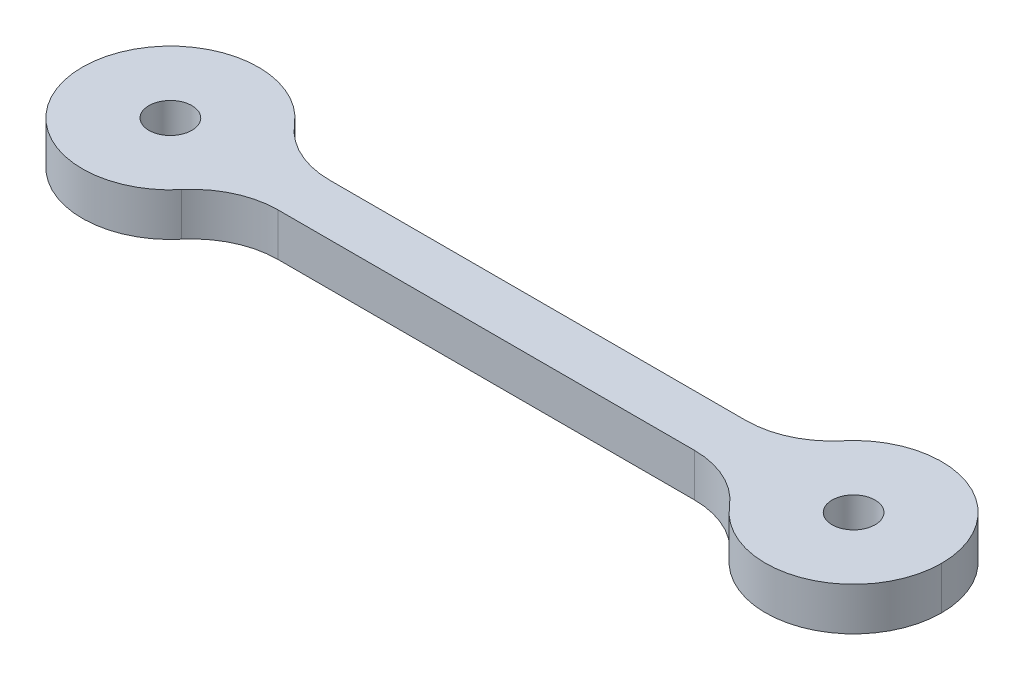
ISO-10303-21;
HEADER;
FILE_DESCRIPTION(('STEP AP214'),'2;1');
FILE_NAME('part.step','',(''),(''),'','','');
FILE_SCHEMA(('AUTOMOTIVE_DESIGN { 1 0 10303 214 1 1 1 1 }'));
ENDSEC;
DATA;
#1=APPLICATION_CONTEXT('core data for automotive mechanical design processes');
#2=APPLICATION_PROTOCOL_DEFINITION('international standard','automotive_design',2000,#1);
#3=PRODUCT_CONTEXT('',#1,'mechanical');
#4=PRODUCT('Part','Part','',(#3));
#5=PRODUCT_RELATED_PRODUCT_CATEGORY('part','',(#4));
#6=PRODUCT_DEFINITION_FORMATION('','',#4);
#7=PRODUCT_DEFINITION_CONTEXT('part definition',#1,'design');
#8=PRODUCT_DEFINITION('design','',#6,#7);
#9=PRODUCT_DEFINITION_SHAPE('','',#8);
#10=(LENGTH_UNIT() NAMED_UNIT(*) SI_UNIT(.MILLI.,.METRE.));
#11=(NAMED_UNIT(*) PLANE_ANGLE_UNIT() SI_UNIT($,.RADIAN.));
#12=(NAMED_UNIT(*) SI_UNIT($,.STERADIAN.) SOLID_ANGLE_UNIT());
#13=UNCERTAINTY_MEASURE_WITH_UNIT(LENGTH_MEASURE(1.E-05),#10,'distance_accuracy_value','');
#14=(GEOMETRIC_REPRESENTATION_CONTEXT(3) GLOBAL_UNCERTAINTY_ASSIGNED_CONTEXT((#13)) GLOBAL_UNIT_ASSIGNED_CONTEXT((#10,
#11,#12)) REPRESENTATION_CONTEXT('',''));
#15=CARTESIAN_POINT('',(0.,0.,0.));
#16=DIRECTION('',(0.,0.,1.));
#17=DIRECTION('',(1.,0.,0.));
#18=AXIS2_PLACEMENT_3D('',#15,#16,#17);
#19=CARTESIAN_POINT('',(0.,5.,0.));
#20=DIRECTION('',(0.,-1.,0.));
#21=DIRECTION('',(0.,0.,-1.));
#22=AXIS2_PLACEMENT_3D('',#19,#20,#21);
#23=PLANE('',#22);
#24=DIRECTION('',(1.,0.,0.));
#25=VECTOR('',#24,1.);
#26=CARTESIAN_POINT('',(20.0511478919563,5.,-13.25));
#27=LINE('',#26,#25);
#28=CARTESIAN_POINT('',(25.7761875552242,5.,-13.25));
#29=VERTEX_POINT('',#28);
#30=CARTESIAN_POINT('',(74.2238124447758,5.,-13.25));
#31=VERTEX_POINT('',#30);
#32=EDGE_CURVE('E137',#29,#31,#27,.T.);
#33=ORIENTED_EDGE('',*,*,#32,.F.);
#34=CARTESIAN_POINT('',(25.7761875552242,5.,-23.25));
#35=DIRECTION('',(0.,-1.,0.));
#36=DIRECTION('',(0.,0.,-1.));
#37=AXIS2_PLACEMENT_3D('',#34,#35,#36);
#38=CIRCLE('',#37,10.);
#39=CARTESIAN_POINT('',(18.1089344415333,5.,-16.8302469135803));
#40=VERTEX_POINT('',#39);
#41=EDGE_CURVE('E170',#29,#40,#38,.T.);
#42=ORIENTED_EDGE('',*,*,#41,.T.);
#43=CARTESIAN_POINT('',(10.25,5.,-10.25));
#44=DIRECTION('',(0.,-1.,0.));
#45=DIRECTION('',(0.,0.,-1.));
#46=AXIS2_PLACEMENT_3D('',#43,#44,#45);
#47=CIRCLE('',#46,10.25);
#48=CARTESIAN_POINT('',(0.,5.,-10.25));
#49=VERTEX_POINT('',#48);
#50=EDGE_CURVE('E247',#40,#49,#47,.F.);
#51=ORIENTED_EDGE('',*,*,#50,.T.);
#52=CARTESIAN_POINT('',(10.25,5.,-10.25));
#53=DIRECTION('',(0.,-1.,0.));
#54=DIRECTION('',(0.,0.,-1.));
#55=AXIS2_PLACEMENT_3D('',#52,#53,#54);
#56=CIRCLE('',#55,10.25);
#57=CARTESIAN_POINT('',(18.1089344415333,5.,-3.66975308641975));
#58=VERTEX_POINT('',#57);
#59=EDGE_CURVE('E129',#49,#58,#56,.F.);
#60=ORIENTED_EDGE('',*,*,#59,.T.);
#61=CARTESIAN_POINT('',(25.7761875552242,5.,2.75));
#62=DIRECTION('',(0.,-1.,0.));
#63=DIRECTION('',(0.,0.,-1.));
#64=AXIS2_PLACEMENT_3D('',#61,#62,#63);
#65=CIRCLE('',#64,10.);
#66=CARTESIAN_POINT('',(25.7761875552242,5.,-7.25));
#67=VERTEX_POINT('',#66);
#68=EDGE_CURVE('E41',#58,#67,#65,.T.);
#69=ORIENTED_EDGE('',*,*,#68,.T.);
#70=DIRECTION('',(-1.,0.,0.));
#71=VECTOR('',#70,1.);
#72=CARTESIAN_POINT('',(20.0511478919563,5.,-7.25));
#73=LINE('',#72,#71);
#74=CARTESIAN_POINT('',(74.2238124447758,5.,-7.25000000000002));
#75=VERTEX_POINT('',#74);
#76=EDGE_CURVE('E182',#75,#67,#73,.T.);
#77=ORIENTED_EDGE('',*,*,#76,.F.);
#78=CARTESIAN_POINT('',(74.2238124447758,5.,2.74999999999998));
#79=DIRECTION('',(0.,-1.,0.));
#80=DIRECTION('',(0.,0.,-1.));
#81=AXIS2_PLACEMENT_3D('',#78,#79,#80);
#82=CIRCLE('',#81,10.);
#83=CARTESIAN_POINT('',(81.8910655584668,5.,-3.66975308641976));
#84=VERTEX_POINT('',#83);
#85=EDGE_CURVE('E174',#75,#84,#82,.T.);
#86=ORIENTED_EDGE('',*,*,#85,.T.);
#87=CARTESIAN_POINT('',(89.75,5.,-10.25));
#88=DIRECTION('',(0.,-1.,0.));
#89=DIRECTION('',(0.,0.,-1.));
#90=AXIS2_PLACEMENT_3D('',#87,#88,#89);
#91=CIRCLE('',#90,10.25);
#92=CARTESIAN_POINT('',(100.,5.,-10.25));
#93=VERTEX_POINT('',#92);
#94=EDGE_CURVE('E115',#84,#93,#91,.F.);
#95=ORIENTED_EDGE('',*,*,#94,.T.);
#96=CARTESIAN_POINT('',(89.75,5.,-10.25));
#97=DIRECTION('',(0.,-1.,0.));
#98=DIRECTION('',(0.,0.,-1.));
#99=AXIS2_PLACEMENT_3D('',#96,#97,#98);
#100=CIRCLE('',#99,10.25);
#101=CARTESIAN_POINT('',(81.8910655584668,5.,-16.8302469135803));
#102=VERTEX_POINT('',#101);
#103=EDGE_CURVE('E246',#93,#102,#100,.F.);
#104=ORIENTED_EDGE('',*,*,#103,.T.);
#105=CARTESIAN_POINT('',(74.2238124447758,5.,-23.25));
#106=DIRECTION('',(0.,-1.,0.));
#107=DIRECTION('',(0.,0.,-1.));
#108=AXIS2_PLACEMENT_3D('',#105,#106,#107);
#109=CIRCLE('',#108,10.);
#110=EDGE_CURVE('E166',#102,#31,#109,.T.);
#111=ORIENTED_EDGE('',*,*,#110,.T.);
#112=EDGE_LOOP('',(#33,#42,#51,#60,#69,#77,#86,#95,#104,#111));
#113=FACE_BOUND('',#112,.T.);
#114=CARTESIAN_POINT('',(10.25,5.,-10.25));
#115=DIRECTION('',(0.,1.,0.));
#116=DIRECTION('',(0.,0.,1.));
#117=AXIS2_PLACEMENT_3D('',#114,#115,#116);
#118=CIRCLE('',#117,2.5);
#119=CARTESIAN_POINT('',(10.25,5.,-7.75));
#120=VERTEX_POINT('',#119);
#121=EDGE_CURVE('E241',#120,#120,#118,.T.);
#122=ORIENTED_EDGE('',*,*,#121,.F.);
#123=EDGE_LOOP('',(#122));
#124=FACE_BOUND('',#123,.T.);
#125=CARTESIAN_POINT('',(89.75,5.,-10.25));
#126=DIRECTION('',(0.,1.,0.));
#127=DIRECTION('',(0.,0.,-1.));
#128=AXIS2_PLACEMENT_3D('',#125,#126,#127);
#129=CIRCLE('',#128,2.50000000000001);
#130=CARTESIAN_POINT('',(89.75,5.,-12.75));
#131=VERTEX_POINT('',#130);
#132=EDGE_CURVE('E134',#131,#131,#129,.T.);
#133=ORIENTED_EDGE('',*,*,#132,.F.);
#134=EDGE_LOOP('',(#133));
#135=FACE_BOUND('',#134,.T.);
#136=ADVANCED_FACE('F33',(#113,#124,#135),#23,.F.);
#137=CARTESIAN_POINT('',(0.,0.,0.));
#138=DIRECTION('',(0.,-1.,0.));
#139=DIRECTION('',(0.,0.,-1.));
#140=AXIS2_PLACEMENT_3D('',#137,#138,#139);
#141=PLANE('',#140);
#142=CARTESIAN_POINT('',(10.25,0.,-10.25));
#143=DIRECTION('',(0.,-1.,0.));
#144=DIRECTION('',(0.,0.,-1.));
#145=AXIS2_PLACEMENT_3D('',#142,#143,#144);
#146=CIRCLE('',#145,10.25);
#147=CARTESIAN_POINT('',(0.,0.,-10.25));
#148=VERTEX_POINT('',#147);
#149=CARTESIAN_POINT('',(18.1089344415333,0.,-16.8302469135803));
#150=VERTEX_POINT('',#149);
#151=EDGE_CURVE('E111',#148,#150,#146,.T.);
#152=ORIENTED_EDGE('',*,*,#151,.T.);
#153=CARTESIAN_POINT('',(25.7761875552242,0.,-23.25));
#154=DIRECTION('',(0.,-1.,0.));
#155=DIRECTION('',(0.,0.,-1.));
#156=AXIS2_PLACEMENT_3D('',#153,#154,#155);
#157=CIRCLE('',#156,10.);
#158=CARTESIAN_POINT('',(25.7761875552242,0.,-13.25));
#159=VERTEX_POINT('',#158);
#160=EDGE_CURVE('E172',#150,#159,#157,.F.);
#161=ORIENTED_EDGE('',*,*,#160,.T.);
#162=DIRECTION('',(-1.,0.,0.));
#163=VECTOR('',#162,1.);
#164=CARTESIAN_POINT('',(0.,0.,-13.25));
#165=LINE('',#164,#163);
#166=CARTESIAN_POINT('',(74.2238124447758,0.,-13.25));
#167=VERTEX_POINT('',#166);
#168=EDGE_CURVE('E145',#167,#159,#165,.T.);
#169=ORIENTED_EDGE('',*,*,#168,.F.);
#170=CARTESIAN_POINT('',(74.2238124447758,0.,-23.25));
#171=DIRECTION('',(0.,-1.,0.));
#172=DIRECTION('',(0.,0.,-1.));
#173=AXIS2_PLACEMENT_3D('',#170,#171,#172);
#174=CIRCLE('',#173,10.);
#175=CARTESIAN_POINT('',(81.8910655584668,0.,-16.8302469135803));
#176=VERTEX_POINT('',#175);
#177=EDGE_CURVE('E168',#167,#176,#174,.F.);
#178=ORIENTED_EDGE('',*,*,#177,.T.);
#179=CARTESIAN_POINT('',(89.75,0.,-10.25));
#180=DIRECTION('',(0.,-1.,0.));
#181=DIRECTION('',(0.,0.,-1.));
#182=AXIS2_PLACEMENT_3D('',#179,#180,#181);
#183=CIRCLE('',#182,10.25);
#184=CARTESIAN_POINT('',(100.,0.,-10.25));
#185=VERTEX_POINT('',#184);
#186=EDGE_CURVE('E125',#176,#185,#183,.T.);
#187=ORIENTED_EDGE('',*,*,#186,.T.);
#188=CARTESIAN_POINT('',(89.75,0.,-10.25));
#189=DIRECTION('',(0.,-1.,0.));
#190=DIRECTION('',(0.,0.,-1.));
#191=AXIS2_PLACEMENT_3D('',#188,#189,#190);
#192=CIRCLE('',#191,10.25);
#193=CARTESIAN_POINT('',(81.8910655584668,0.,-3.66975308641976));
#194=VERTEX_POINT('',#193);
#195=EDGE_CURVE('E239',#185,#194,#192,.T.);
#196=ORIENTED_EDGE('',*,*,#195,.T.);
#197=CARTESIAN_POINT('',(74.2238124447758,0.,2.74999999999998));
#198=DIRECTION('',(0.,-1.,0.));
#199=DIRECTION('',(0.,0.,-1.));
#200=AXIS2_PLACEMENT_3D('',#197,#198,#199);
#201=CIRCLE('',#200,10.);
#202=CARTESIAN_POINT('',(74.2238124447758,0.,-7.25000000000002));
#203=VERTEX_POINT('',#202);
#204=EDGE_CURVE('E176',#194,#203,#201,.F.);
#205=ORIENTED_EDGE('',*,*,#204,.T.);
#206=DIRECTION('',(1.,0.,0.));
#207=VECTOR('',#206,1.);
#208=CARTESIAN_POINT('',(0.,0.,-7.24999999999999));
#209=LINE('',#208,#207);
#210=CARTESIAN_POINT('',(25.7761875552242,0.,-7.25));
#211=VERTEX_POINT('',#210);
#212=EDGE_CURVE('E142',#211,#203,#209,.T.);
#213=ORIENTED_EDGE('',*,*,#212,.F.);
#214=CARTESIAN_POINT('',(25.7761875552242,0.,2.75));
#215=DIRECTION('',(0.,-1.,0.));
#216=DIRECTION('',(0.,0.,-1.));
#217=AXIS2_PLACEMENT_3D('',#214,#215,#216);
#218=CIRCLE('',#217,10.);
#219=CARTESIAN_POINT('',(18.1089344415333,0.,-3.66975308641975));
#220=VERTEX_POINT('',#219);
#221=EDGE_CURVE('E11',#211,#220,#218,.F.);
#222=ORIENTED_EDGE('',*,*,#221,.T.);
#223=CARTESIAN_POINT('',(10.25,0.,-10.25));
#224=DIRECTION('',(0.,-1.,0.));
#225=DIRECTION('',(0.,0.,-1.));
#226=AXIS2_PLACEMENT_3D('',#223,#224,#225);
#227=CIRCLE('',#226,10.25);
#228=EDGE_CURVE('E107',#220,#148,#227,.T.);
#229=ORIENTED_EDGE('',*,*,#228,.T.);
#230=EDGE_LOOP('',(#152,#161,#169,#178,#187,#196,#205,#213,#222,#229));
#231=FACE_BOUND('',#230,.T.);
#232=CARTESIAN_POINT('',(10.25,0.,-10.25));
#233=DIRECTION('',(0.,1.,0.));
#234=DIRECTION('',(0.,0.,1.));
#235=AXIS2_PLACEMENT_3D('',#232,#233,#234);
#236=CIRCLE('',#235,2.5);
#237=CARTESIAN_POINT('',(10.25,0.,-7.75));
#238=VERTEX_POINT('',#237);
#239=EDGE_CURVE('E251',#238,#238,#236,.T.);
#240=ORIENTED_EDGE('',*,*,#239,.T.);
#241=EDGE_LOOP('',(#240));
#242=FACE_BOUND('',#241,.T.);
#243=CARTESIAN_POINT('',(89.75,0.,-10.25));
#244=DIRECTION('',(0.,1.,0.));
#245=DIRECTION('',(0.,0.,-1.));
#246=AXIS2_PLACEMENT_3D('',#243,#244,#245);
#247=CIRCLE('',#246,2.50000000000001);
#248=CARTESIAN_POINT('',(89.75,0.,-12.75));
#249=VERTEX_POINT('',#248);
#250=EDGE_CURVE('E130',#249,#249,#247,.T.);
#251=ORIENTED_EDGE('',*,*,#250,.T.);
#252=EDGE_LOOP('',(#251));
#253=FACE_BOUND('',#252,.T.);
#254=ADVANCED_FACE('F109',(#231,#242,#253),#141,.T.);
#255=CARTESIAN_POINT('',(10.25,5.,-10.25));
#256=DIRECTION('',(0.,-1.,0.));
#257=DIRECTION('',(0.,0.,-1.));
#258=AXIS2_PLACEMENT_3D('',#255,#256,#257);
#259=CYLINDRICAL_SURFACE('',#258,2.5);
#260=ORIENTED_EDGE('',*,*,#121,.T.);
#261=EDGE_LOOP('',(#260));
#262=FACE_BOUND('',#261,.T.);
#263=ORIENTED_EDGE('',*,*,#239,.F.);
#264=EDGE_LOOP('',(#263));
#265=FACE_BOUND('',#264,.T.);
#266=ADVANCED_FACE('F199',(#262,#265),#259,.F.);
#267=CARTESIAN_POINT('',(89.75,5.,-10.25));
#268=DIRECTION('',(0.,-1.,0.));
#269=DIRECTION('',(0.,0.,-1.));
#270=AXIS2_PLACEMENT_3D('',#267,#268,#269);
#271=CYLINDRICAL_SURFACE('',#270,2.50000000000001);
#272=ORIENTED_EDGE('',*,*,#132,.T.);
#273=EDGE_LOOP('',(#272));
#274=FACE_BOUND('',#273,.T.);
#275=ORIENTED_EDGE('',*,*,#250,.F.);
#276=EDGE_LOOP('',(#275));
#277=FACE_BOUND('',#276,.T.);
#278=ADVANCED_FACE('F209',(#274,#277),#271,.F.);
#279=CARTESIAN_POINT('',(10.25,5.,-10.25));
#280=DIRECTION('',(0.,-1.,0.));
#281=DIRECTION('',(0.,0.,-1.));
#282=AXIS2_PLACEMENT_3D('',#279,#280,#281);
#283=CYLINDRICAL_SURFACE('',#282,10.25);
#284=ORIENTED_EDGE('',*,*,#50,.F.);
#285=DIRECTION('',(0.,-1.,0.));
#286=VECTOR('',#285,1.);
#287=CARTESIAN_POINT('',(18.1089344415333,5.,-16.8302469135803));
#288=LINE('',#287,#286);
#289=EDGE_CURVE('E124',#40,#150,#288,.T.);
#290=ORIENTED_EDGE('',*,*,#289,.T.);
#291=ORIENTED_EDGE('',*,*,#151,.F.);
#292=DIRECTION('',(0.,-1.,0.));
#293=VECTOR('',#292,1.);
#294=CARTESIAN_POINT('',(0.,5.,-10.25));
#295=LINE('',#294,#293);
#296=EDGE_CURVE('E121',#49,#148,#295,.T.);
#297=ORIENTED_EDGE('',*,*,#296,.F.);
#298=EDGE_LOOP('',(#284,#290,#291,#297));
#299=FACE_BOUND('',#298,.T.);
#300=ADVANCED_FACE('F120',(#299),#283,.T.);
#301=CARTESIAN_POINT('',(10.25,5.,-10.25));
#302=DIRECTION('',(0.,-1.,0.));
#303=DIRECTION('',(0.,0.,-1.));
#304=AXIS2_PLACEMENT_3D('',#301,#302,#303);
#305=CYLINDRICAL_SURFACE('',#304,10.25);
#306=ORIENTED_EDGE('',*,*,#228,.F.);
#307=DIRECTION('',(0.,-1.,0.));
#308=VECTOR('',#307,1.);
#309=CARTESIAN_POINT('',(18.1089344415333,5.,-3.66975308641975));
#310=LINE('',#309,#308);
#311=EDGE_CURVE('E164',#220,#58,#310,.F.);
#312=ORIENTED_EDGE('',*,*,#311,.T.);
#313=ORIENTED_EDGE('',*,*,#59,.F.);
#314=ORIENTED_EDGE('',*,*,#296,.T.);
#315=EDGE_LOOP('',(#306,#312,#313,#314));
#316=FACE_BOUND('',#315,.T.);
#317=ADVANCED_FACE('F127',(#316),#305,.T.);
#318=CARTESIAN_POINT('',(89.75,5.,-10.25));
#319=DIRECTION('',(0.,-1.,0.));
#320=DIRECTION('',(0.,0.,-1.));
#321=AXIS2_PLACEMENT_3D('',#318,#319,#320);
#322=CYLINDRICAL_SURFACE('',#321,10.25);
#323=ORIENTED_EDGE('',*,*,#94,.F.);
#324=DIRECTION('',(0.,-1.,0.));
#325=VECTOR('',#324,1.);
#326=CARTESIAN_POINT('',(81.8910655584668,5.,-3.66975308641976));
#327=LINE('',#326,#325);
#328=EDGE_CURVE('E162',#84,#194,#327,.T.);
#329=ORIENTED_EDGE('',*,*,#328,.T.);
#330=ORIENTED_EDGE('',*,*,#195,.F.);
#331=DIRECTION('',(0.,-1.,0.));
#332=VECTOR('',#331,1.);
#333=CARTESIAN_POINT('',(100.,5.,-10.25));
#334=LINE('',#333,#332);
#335=EDGE_CURVE('E131',#93,#185,#334,.T.);
#336=ORIENTED_EDGE('',*,*,#335,.F.);
#337=EDGE_LOOP('',(#323,#329,#330,#336));
#338=FACE_BOUND('',#337,.T.);
#339=ADVANCED_FACE('F206',(#338),#322,.T.);
#340=CARTESIAN_POINT('',(89.75,5.,-10.25));
#341=DIRECTION('',(0.,-1.,0.));
#342=DIRECTION('',(0.,0.,-1.));
#343=AXIS2_PLACEMENT_3D('',#340,#341,#342);
#344=CYLINDRICAL_SURFACE('',#343,10.25);
#345=ORIENTED_EDGE('',*,*,#186,.F.);
#346=DIRECTION('',(0.,-1.,0.));
#347=VECTOR('',#346,1.);
#348=CARTESIAN_POINT('',(81.8910655584668,5.,-16.8302469135803));
#349=LINE('',#348,#347);
#350=EDGE_CURVE('E148',#176,#102,#349,.F.);
#351=ORIENTED_EDGE('',*,*,#350,.T.);
#352=ORIENTED_EDGE('',*,*,#103,.F.);
#353=ORIENTED_EDGE('',*,*,#335,.T.);
#354=EDGE_LOOP('',(#345,#351,#352,#353));
#355=FACE_BOUND('',#354,.T.);
#356=ADVANCED_FACE('F210',(#355),#344,.T.);
#357=CARTESIAN_POINT('',(20.0511478919563,-5.,-13.25));
#358=DIRECTION('',(0.,0.,1.));
#359=DIRECTION('',(1.,0.,0.));
#360=AXIS2_PLACEMENT_3D('',#357,#358,#359);
#361=PLANE('',#360);
#362=ORIENTED_EDGE('',*,*,#32,.T.);
#363=DIRECTION('',(0.,-1.,0.));
#364=VECTOR('',#363,1.);
#365=CARTESIAN_POINT('',(74.2238124447758,-5.,-13.25));
#366=LINE('',#365,#364);
#367=EDGE_CURVE('E154',#31,#167,#366,.T.);
#368=ORIENTED_EDGE('',*,*,#367,.T.);
#369=ORIENTED_EDGE('',*,*,#168,.T.);
#370=DIRECTION('',(0.,-1.,0.));
#371=VECTOR('',#370,1.);
#372=CARTESIAN_POINT('',(25.7761875552242,-5.,-13.25));
#373=LINE('',#372,#371);
#374=EDGE_CURVE('E151',#159,#29,#373,.F.);
#375=ORIENTED_EDGE('',*,*,#374,.T.);
#376=EDGE_LOOP('',(#362,#368,#369,#375));
#377=FACE_BOUND('',#376,.T.);
#378=ADVANCED_FACE('F213',(#377),#361,.F.);
#379=CARTESIAN_POINT('',(20.0511478919563,-5.,-7.25));
#380=DIRECTION('',(0.,0.,-1.));
#381=DIRECTION('',(-1.,0.,0.));
#382=AXIS2_PLACEMENT_3D('',#379,#380,#381);
#383=PLANE('',#382);
#384=ORIENTED_EDGE('',*,*,#212,.T.);
#385=DIRECTION('',(0.,-1.,0.));
#386=VECTOR('',#385,1.);
#387=CARTESIAN_POINT('',(74.2238124447758,-5.,-7.25000000000002));
#388=LINE('',#387,#386);
#389=EDGE_CURVE('E159',#203,#75,#388,.F.);
#390=ORIENTED_EDGE('',*,*,#389,.T.);
#391=ORIENTED_EDGE('',*,*,#76,.T.);
#392=DIRECTION('',(0.,-1.,0.));
#393=VECTOR('',#392,1.);
#394=CARTESIAN_POINT('',(25.7761875552242,-5.,-7.25));
#395=LINE('',#394,#393);
#396=EDGE_CURVE('E157',#67,#211,#395,.T.);
#397=ORIENTED_EDGE('',*,*,#396,.T.);
#398=EDGE_LOOP('',(#384,#390,#391,#397));
#399=FACE_BOUND('',#398,.T.);
#400=ADVANCED_FACE('F184',(#399),#383,.F.);
#401=CARTESIAN_POINT('',(74.2238124447758,5.,-23.25));
#402=DIRECTION('',(0.,-1.,0.));
#403=DIRECTION('',(0.,0.,-1.));
#404=AXIS2_PLACEMENT_3D('',#401,#402,#403);
#405=CYLINDRICAL_SURFACE('',#404,10.);
#406=ORIENTED_EDGE('',*,*,#177,.F.);
#407=ORIENTED_EDGE('',*,*,#367,.F.);
#408=ORIENTED_EDGE('',*,*,#110,.F.);
#409=ORIENTED_EDGE('',*,*,#350,.F.);
#410=EDGE_LOOP('',(#406,#407,#408,#409));
#411=FACE_BOUND('',#410,.T.);
#412=ADVANCED_FACE('F218',(#411),#405,.F.);
#413=CARTESIAN_POINT('',(25.7761875552242,5.,-23.25));
#414=DIRECTION('',(0.,-1.,0.));
#415=DIRECTION('',(0.,0.,-1.));
#416=AXIS2_PLACEMENT_3D('',#413,#414,#415);
#417=CYLINDRICAL_SURFACE('',#416,10.);
#418=ORIENTED_EDGE('',*,*,#160,.F.);
#419=ORIENTED_EDGE('',*,*,#289,.F.);
#420=ORIENTED_EDGE('',*,*,#41,.F.);
#421=ORIENTED_EDGE('',*,*,#374,.F.);
#422=EDGE_LOOP('',(#418,#419,#420,#421));
#423=FACE_BOUND('',#422,.T.);
#424=ADVANCED_FACE('F192',(#423),#417,.F.);
#425=CARTESIAN_POINT('',(74.2238124447758,5.,2.74999999999998));
#426=DIRECTION('',(0.,-1.,0.));
#427=DIRECTION('',(0.,0.,-1.));
#428=AXIS2_PLACEMENT_3D('',#425,#426,#427);
#429=CYLINDRICAL_SURFACE('',#428,10.);
#430=ORIENTED_EDGE('',*,*,#204,.F.);
#431=ORIENTED_EDGE('',*,*,#328,.F.);
#432=ORIENTED_EDGE('',*,*,#85,.F.);
#433=ORIENTED_EDGE('',*,*,#389,.F.);
#434=EDGE_LOOP('',(#430,#431,#432,#433));
#435=FACE_BOUND('',#434,.T.);
#436=ADVANCED_FACE('F188',(#435),#429,.F.);
#437=CARTESIAN_POINT('',(25.7761875552242,5.,2.75));
#438=DIRECTION('',(0.,-1.,0.));
#439=DIRECTION('',(0.,0.,-1.));
#440=AXIS2_PLACEMENT_3D('',#437,#438,#439);
#441=CYLINDRICAL_SURFACE('',#440,10.);
#442=ORIENTED_EDGE('',*,*,#221,.F.);
#443=ORIENTED_EDGE('',*,*,#396,.F.);
#444=ORIENTED_EDGE('',*,*,#68,.F.);
#445=ORIENTED_EDGE('',*,*,#311,.F.);
#446=EDGE_LOOP('',(#442,#443,#444,#445));
#447=FACE_BOUND('',#446,.T.);
#448=ADVANCED_FACE('F35',(#447),#441,.F.);
#449=CLOSED_SHELL('',(#136,#254,#266,#278,#300,#317,#339,#356,#378,#400,#412,#424,#436,#448));
#450=MANIFOLD_SOLID_BREP('B2',#449);
#451=ADVANCED_BREP_SHAPE_REPRESENTATION('',(#18,#450),#14);
#452=SHAPE_DEFINITION_REPRESENTATION(#9,#451);
ENDSEC;
END-ISO-10303-21;
